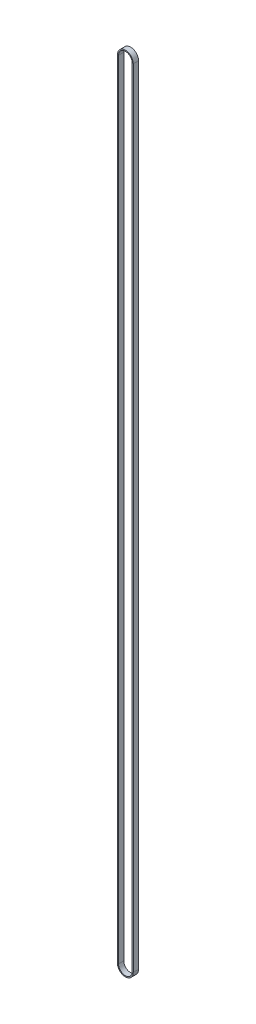
ISO-10303-21;
HEADER;
FILE_DESCRIPTION(('STEP AP214'),'2;1');
FILE_NAME('part.step','',(''),(''),'','','');
FILE_SCHEMA(('AUTOMOTIVE_DESIGN { 1 0 10303 214 1 1 1 1 }'));
ENDSEC;
DATA;
#1=APPLICATION_CONTEXT('core data for automotive mechanical design processes');
#2=APPLICATION_PROTOCOL_DEFINITION('international standard','automotive_design',2000,#1);
#3=PRODUCT_CONTEXT('',#1,'mechanical');
#4=PRODUCT('Part','Part','',(#3));
#5=PRODUCT_RELATED_PRODUCT_CATEGORY('part','',(#4));
#6=PRODUCT_DEFINITION_FORMATION('','',#4);
#7=PRODUCT_DEFINITION_CONTEXT('part definition',#1,'design');
#8=PRODUCT_DEFINITION('design','',#6,#7);
#9=PRODUCT_DEFINITION_SHAPE('','',#8);
#10=(LENGTH_UNIT() NAMED_UNIT(*) SI_UNIT(.MILLI.,.METRE.));
#11=(NAMED_UNIT(*) PLANE_ANGLE_UNIT() SI_UNIT($,.RADIAN.));
#12=(NAMED_UNIT(*) SI_UNIT($,.STERADIAN.) SOLID_ANGLE_UNIT());
#13=UNCERTAINTY_MEASURE_WITH_UNIT(LENGTH_MEASURE(1.E-05),#10,'distance_accuracy_value','');
#14=(GEOMETRIC_REPRESENTATION_CONTEXT(3) GLOBAL_UNCERTAINTY_ASSIGNED_CONTEXT((#13)) GLOBAL_UNIT_ASSIGNED_CONTEXT((#10,
#11,#12)) REPRESENTATION_CONTEXT('',''));
#15=CARTESIAN_POINT('',(0.,0.,0.));
#16=DIRECTION('',(0.,0.,1.));
#17=DIRECTION('',(1.,0.,0.));
#18=AXIS2_PLACEMENT_3D('',#15,#16,#17);
#19=CARTESIAN_POINT('',(0.,753.5,5.));
#20=DIRECTION('',(0.,0.,1.));
#21=DIRECTION('',(1.,0.,0.));
#22=AXIS2_PLACEMENT_3D('',#19,#20,#21);
#23=PLANE('',#22);
#24=CARTESIAN_POINT('',(0.,753.5,5.));
#25=DIRECTION('',(0.,0.,1.));
#26=DIRECTION('',(1.,0.,0.));
#27=AXIS2_PLACEMENT_3D('',#24,#25,#26);
#28=CIRCLE('',#27,7.5);
#29=CARTESIAN_POINT('',(7.5,753.5,5.));
#30=VERTEX_POINT('',#29);
#31=CARTESIAN_POINT('',(-7.5,753.5,5.));
#32=VERTEX_POINT('',#31);
#33=EDGE_CURVE('E136',#30,#32,#28,.T.);
#34=ORIENTED_EDGE('',*,*,#33,.T.);
#35=DIRECTION('',(0.,-1.,0.));
#36=VECTOR('',#35,1.);
#37=CARTESIAN_POINT('',(-7.5,753.5,5.));
#38=LINE('',#37,#36);
#39=CARTESIAN_POINT('',(-7.50000000000009,6.50000000000009,5.));
#40=VERTEX_POINT('',#39);
#41=EDGE_CURVE('E139',#32,#40,#38,.T.);
#42=ORIENTED_EDGE('',*,*,#41,.T.);
#43=CARTESIAN_POINT('',(0.,6.50000000000009,5.));
#44=DIRECTION('',(0.,0.,1.));
#45=DIRECTION('',(-1.,0.,0.));
#46=AXIS2_PLACEMENT_3D('',#43,#44,#45);
#47=CIRCLE('',#46,7.50000000000009);
#48=CARTESIAN_POINT('',(7.50000000000009,6.50000000000006,5.));
#49=VERTEX_POINT('',#48);
#50=EDGE_CURVE('E142',#40,#49,#47,.T.);
#51=ORIENTED_EDGE('',*,*,#50,.T.);
#52=DIRECTION('',(0.,1.,0.));
#53=VECTOR('',#52,1.);
#54=CARTESIAN_POINT('',(7.5,753.5,5.));
#55=LINE('',#54,#53);
#56=EDGE_CURVE('E144',#49,#30,#55,.T.);
#57=ORIENTED_EDGE('',*,*,#56,.T.);
#58=EDGE_LOOP('',(#34,#42,#51,#57));
#59=FACE_BOUND('',#58,.T.);
#60=DIRECTION('',(0.,-1.,0.));
#61=VECTOR('',#60,1.);
#62=CARTESIAN_POINT('',(-6.5,753.5,5.));
#63=LINE('',#62,#61);
#64=CARTESIAN_POINT('',(-6.5,753.5,5.));
#65=VERTEX_POINT('',#64);
#66=CARTESIAN_POINT('',(-6.50000000000009,6.50000000000009,5.));
#67=VERTEX_POINT('',#66);
#68=EDGE_CURVE('E108',#65,#67,#63,.T.);
#69=ORIENTED_EDGE('',*,*,#68,.F.);
#70=CARTESIAN_POINT('',(0.,753.5,5.));
#71=DIRECTION('',(0.,0.,1.));
#72=DIRECTION('',(1.,0.,0.));
#73=AXIS2_PLACEMENT_3D('',#70,#71,#72);
#74=CIRCLE('',#73,6.5);
#75=CARTESIAN_POINT('',(6.5,753.5,5.));
#76=VERTEX_POINT('',#75);
#77=EDGE_CURVE('E100',#76,#65,#74,.T.);
#78=ORIENTED_EDGE('',*,*,#77,.F.);
#79=DIRECTION('',(0.,1.,0.));
#80=VECTOR('',#79,1.);
#81=CARTESIAN_POINT('',(6.5,753.5,5.));
#82=LINE('',#81,#80);
#83=CARTESIAN_POINT('',(6.50000000000009,6.50000000000017,5.));
#84=VERTEX_POINT('',#83);
#85=EDGE_CURVE('E122',#84,#76,#82,.T.);
#86=ORIENTED_EDGE('',*,*,#85,.F.);
#87=CARTESIAN_POINT('',(0.,6.50000000000009,5.));
#88=DIRECTION('',(0.,0.,1.));
#89=DIRECTION('',(-1.,0.,0.));
#90=AXIS2_PLACEMENT_3D('',#87,#88,#89);
#91=CIRCLE('',#90,6.50000000000009);
#92=EDGE_CURVE('E120',#67,#84,#91,.T.);
#93=ORIENTED_EDGE('',*,*,#92,.F.);
#94=EDGE_LOOP('',(#69,#78,#86,#93));
#95=FACE_BOUND('',#94,.T.);
#96=ADVANCED_FACE('F35',(#59,#95),#23,.T.);
#97=CARTESIAN_POINT('',(0.,753.5,0.));
#98=DIRECTION('',(0.,0.,1.));
#99=DIRECTION('',(1.,0.,0.));
#100=AXIS2_PLACEMENT_3D('',#97,#98,#99);
#101=PLANE('',#100);
#102=CARTESIAN_POINT('',(0.,753.5,0.));
#103=DIRECTION('',(0.,0.,1.));
#104=DIRECTION('',(1.,0.,0.));
#105=AXIS2_PLACEMENT_3D('',#102,#103,#104);
#106=CIRCLE('',#105,7.5);
#107=CARTESIAN_POINT('',(7.5,753.5,0.));
#108=VERTEX_POINT('',#107);
#109=CARTESIAN_POINT('',(-7.5,753.5,0.));
#110=VERTEX_POINT('',#109);
#111=EDGE_CURVE('E116',#108,#110,#106,.T.);
#112=ORIENTED_EDGE('',*,*,#111,.F.);
#113=DIRECTION('',(0.,1.,0.));
#114=VECTOR('',#113,1.);
#115=CARTESIAN_POINT('',(7.5,753.5,0.));
#116=LINE('',#115,#114);
#117=CARTESIAN_POINT('',(7.50000000000009,6.50000000000006,0.));
#118=VERTEX_POINT('',#117);
#119=EDGE_CURVE('E140',#118,#108,#116,.T.);
#120=ORIENTED_EDGE('',*,*,#119,.F.);
#121=CARTESIAN_POINT('',(0.,6.50000000000009,0.));
#122=DIRECTION('',(0.,0.,1.));
#123=DIRECTION('',(-1.,0.,0.));
#124=AXIS2_PLACEMENT_3D('',#121,#122,#123);
#125=CIRCLE('',#124,7.50000000000009);
#126=CARTESIAN_POINT('',(-7.50000000000009,6.50000000000009,0.));
#127=VERTEX_POINT('',#126);
#128=EDGE_CURVE('E151',#127,#118,#125,.T.);
#129=ORIENTED_EDGE('',*,*,#128,.F.);
#130=DIRECTION('',(0.,-1.,0.));
#131=VECTOR('',#130,1.);
#132=CARTESIAN_POINT('',(-7.5,753.5,0.));
#133=LINE('',#132,#131);
#134=EDGE_CURVE('E149',#110,#127,#133,.T.);
#135=ORIENTED_EDGE('',*,*,#134,.F.);
#136=EDGE_LOOP('',(#112,#120,#129,#135));
#137=FACE_BOUND('',#136,.T.);
#138=CARTESIAN_POINT('',(0.,753.5,0.));
#139=DIRECTION('',(0.,0.,1.));
#140=DIRECTION('',(1.,0.,0.));
#141=AXIS2_PLACEMENT_3D('',#138,#139,#140);
#142=CIRCLE('',#141,6.5);
#143=CARTESIAN_POINT('',(6.5,753.5,0.));
#144=VERTEX_POINT('',#143);
#145=CARTESIAN_POINT('',(-6.5,753.5,0.));
#146=VERTEX_POINT('',#145);
#147=EDGE_CURVE('E58',#144,#146,#142,.T.);
#148=ORIENTED_EDGE('',*,*,#147,.T.);
#149=DIRECTION('',(0.,-1.,0.));
#150=VECTOR('',#149,1.);
#151=CARTESIAN_POINT('',(-6.5,753.5,0.));
#152=LINE('',#151,#150);
#153=CARTESIAN_POINT('',(-6.50000000000009,6.50000000000009,0.));
#154=VERTEX_POINT('',#153);
#155=EDGE_CURVE('E115',#146,#154,#152,.T.);
#156=ORIENTED_EDGE('',*,*,#155,.T.);
#157=CARTESIAN_POINT('',(0.,6.50000000000009,0.));
#158=DIRECTION('',(0.,0.,1.));
#159=DIRECTION('',(-1.,0.,0.));
#160=AXIS2_PLACEMENT_3D('',#157,#158,#159);
#161=CIRCLE('',#160,6.50000000000009);
#162=CARTESIAN_POINT('',(6.50000000000009,6.50000000000009,0.));
#163=VERTEX_POINT('',#162);
#164=EDGE_CURVE('E128',#154,#163,#161,.T.);
#165=ORIENTED_EDGE('',*,*,#164,.T.);
#166=DIRECTION('',(0.,1.,0.));
#167=VECTOR('',#166,1.);
#168=CARTESIAN_POINT('',(6.5,753.5,0.));
#169=LINE('',#168,#167);
#170=EDGE_CURVE('E109',#163,#144,#169,.T.);
#171=ORIENTED_EDGE('',*,*,#170,.T.);
#172=EDGE_LOOP('',(#148,#156,#165,#171));
#173=FACE_BOUND('',#172,.T.);
#174=ADVANCED_FACE('F169',(#137,#173),#101,.F.);
#175=CARTESIAN_POINT('',(0.,753.5,5.));
#176=DIRECTION('',(0.,0.,-1.));
#177=DIRECTION('',(-1.,0.,0.));
#178=AXIS2_PLACEMENT_3D('',#175,#176,#177);
#179=CYLINDRICAL_SURFACE('',#178,7.5);
#180=ORIENTED_EDGE('',*,*,#111,.T.);
#181=DIRECTION('',(0.,0.,-1.));
#182=VECTOR('',#181,1.);
#183=CARTESIAN_POINT('',(-7.5,753.5,5.));
#184=LINE('',#183,#182);
#185=EDGE_CURVE('E11',#32,#110,#184,.T.);
#186=ORIENTED_EDGE('',*,*,#185,.F.);
#187=ORIENTED_EDGE('',*,*,#33,.F.);
#188=DIRECTION('',(0.,0.,-1.));
#189=VECTOR('',#188,1.);
#190=CARTESIAN_POINT('',(7.5,753.5,5.));
#191=LINE('',#190,#189);
#192=EDGE_CURVE('E146',#30,#108,#191,.T.);
#193=ORIENTED_EDGE('',*,*,#192,.T.);
#194=EDGE_LOOP('',(#180,#186,#187,#193));
#195=FACE_BOUND('',#194,.T.);
#196=ADVANCED_FACE('F37',(#195),#179,.T.);
#197=CARTESIAN_POINT('',(-7.5,753.5,5.));
#198=DIRECTION('',(1.,0.,0.));
#199=DIRECTION('',(0.,1.,0.));
#200=AXIS2_PLACEMENT_3D('',#197,#198,#199);
#201=PLANE('',#200);
#202=ORIENTED_EDGE('',*,*,#134,.T.);
#203=DIRECTION('',(0.,0.,-1.));
#204=VECTOR('',#203,1.);
#205=CARTESIAN_POINT('',(-7.50000000000009,6.50000000000009,5.));
#206=LINE('',#205,#204);
#207=EDGE_CURVE('E43',#40,#127,#206,.T.);
#208=ORIENTED_EDGE('',*,*,#207,.F.);
#209=ORIENTED_EDGE('',*,*,#41,.F.);
#210=ORIENTED_EDGE('',*,*,#185,.T.);
#211=EDGE_LOOP('',(#202,#208,#209,#210));
#212=FACE_BOUND('',#211,.T.);
#213=ADVANCED_FACE('F179',(#212),#201,.F.);
#214=CARTESIAN_POINT('',(0.,6.50000000000009,5.));
#215=DIRECTION('',(0.,0.,-1.));
#216=DIRECTION('',(-1.,0.,0.));
#217=AXIS2_PLACEMENT_3D('',#214,#215,#216);
#218=CYLINDRICAL_SURFACE('',#217,7.50000000000009);
#219=ORIENTED_EDGE('',*,*,#128,.T.);
#220=DIRECTION('',(0.,0.,-1.));
#221=VECTOR('',#220,1.);
#222=CARTESIAN_POINT('',(7.50000000000009,6.50000000000006,5.));
#223=LINE('',#222,#221);
#224=EDGE_CURVE('E156',#49,#118,#223,.T.);
#225=ORIENTED_EDGE('',*,*,#224,.F.);
#226=ORIENTED_EDGE('',*,*,#50,.F.);
#227=ORIENTED_EDGE('',*,*,#207,.T.);
#228=EDGE_LOOP('',(#219,#225,#226,#227));
#229=FACE_BOUND('',#228,.T.);
#230=ADVANCED_FACE('F163',(#229),#218,.T.);
#231=CARTESIAN_POINT('',(7.5,753.5,5.));
#232=DIRECTION('',(-1.,0.,0.));
#233=DIRECTION('',(0.,-1.,0.));
#234=AXIS2_PLACEMENT_3D('',#231,#232,#233);
#235=PLANE('',#234);
#236=ORIENTED_EDGE('',*,*,#119,.T.);
#237=ORIENTED_EDGE('',*,*,#192,.F.);
#238=ORIENTED_EDGE('',*,*,#56,.F.);
#239=ORIENTED_EDGE('',*,*,#224,.T.);
#240=EDGE_LOOP('',(#236,#237,#238,#239));
#241=FACE_BOUND('',#240,.T.);
#242=ADVANCED_FACE('F173',(#241),#235,.F.);
#243=CARTESIAN_POINT('',(0.,753.5,5.));
#244=DIRECTION('',(0.,0.,-1.));
#245=DIRECTION('',(-1.,0.,0.));
#246=AXIS2_PLACEMENT_3D('',#243,#244,#245);
#247=CYLINDRICAL_SURFACE('',#246,6.5);
#248=ORIENTED_EDGE('',*,*,#147,.F.);
#249=DIRECTION('',(0.,0.,-1.));
#250=VECTOR('',#249,1.);
#251=CARTESIAN_POINT('',(6.5,753.5,5.));
#252=LINE('',#251,#250);
#253=EDGE_CURVE('E104',#76,#144,#252,.T.);
#254=ORIENTED_EDGE('',*,*,#253,.F.);
#255=ORIENTED_EDGE('',*,*,#77,.T.);
#256=DIRECTION('',(0.,0.,-1.));
#257=VECTOR('',#256,1.);
#258=CARTESIAN_POINT('',(-6.5,753.5,5.));
#259=LINE('',#258,#257);
#260=EDGE_CURVE('E103',#65,#146,#259,.T.);
#261=ORIENTED_EDGE('',*,*,#260,.T.);
#262=EDGE_LOOP('',(#248,#254,#255,#261));
#263=FACE_BOUND('',#262,.T.);
#264=ADVANCED_FACE('F102',(#263),#247,.F.);
#265=CARTESIAN_POINT('',(-6.5,753.5,5.));
#266=DIRECTION('',(1.,0.,0.));
#267=DIRECTION('',(0.,1.,0.));
#268=AXIS2_PLACEMENT_3D('',#265,#266,#267);
#269=PLANE('',#268);
#270=ORIENTED_EDGE('',*,*,#155,.F.);
#271=ORIENTED_EDGE('',*,*,#260,.F.);
#272=ORIENTED_EDGE('',*,*,#68,.T.);
#273=DIRECTION('',(0.,0.,-1.));
#274=VECTOR('',#273,1.);
#275=CARTESIAN_POINT('',(-6.50000000000009,6.50000000000009,5.));
#276=LINE('',#275,#274);
#277=EDGE_CURVE('E117',#67,#154,#276,.T.);
#278=ORIENTED_EDGE('',*,*,#277,.T.);
#279=EDGE_LOOP('',(#270,#271,#272,#278));
#280=FACE_BOUND('',#279,.T.);
#281=ADVANCED_FACE('F112',(#280),#269,.T.);
#282=CARTESIAN_POINT('',(0.,6.50000000000009,5.));
#283=DIRECTION('',(0.,0.,-1.));
#284=DIRECTION('',(-1.,0.,0.));
#285=AXIS2_PLACEMENT_3D('',#282,#283,#284);
#286=CYLINDRICAL_SURFACE('',#285,6.50000000000009);
#287=ORIENTED_EDGE('',*,*,#164,.F.);
#288=ORIENTED_EDGE('',*,*,#277,.F.);
#289=ORIENTED_EDGE('',*,*,#92,.T.);
#290=DIRECTION('',(0.,0.,-1.));
#291=VECTOR('',#290,1.);
#292=CARTESIAN_POINT('',(6.50000000000009,6.50000000000009,5.));
#293=LINE('',#292,#291);
#294=EDGE_CURVE('E50',#84,#163,#293,.T.);
#295=ORIENTED_EDGE('',*,*,#294,.T.);
#296=EDGE_LOOP('',(#287,#288,#289,#295));
#297=FACE_BOUND('',#296,.T.);
#298=ADVANCED_FACE('F202',(#297),#286,.F.);
#299=CARTESIAN_POINT('',(6.5,753.5,5.));
#300=DIRECTION('',(-1.,0.,0.));
#301=DIRECTION('',(0.,-1.,0.));
#302=AXIS2_PLACEMENT_3D('',#299,#300,#301);
#303=PLANE('',#302);
#304=ORIENTED_EDGE('',*,*,#170,.F.);
#305=ORIENTED_EDGE('',*,*,#294,.F.);
#306=ORIENTED_EDGE('',*,*,#85,.T.);
#307=ORIENTED_EDGE('',*,*,#253,.T.);
#308=EDGE_LOOP('',(#304,#305,#306,#307));
#309=FACE_BOUND('',#308,.T.);
#310=ADVANCED_FACE('F206',(#309),#303,.T.);
#311=CLOSED_SHELL('',(#96,#174,#196,#213,#230,#242,#264,#281,#298,#310));
#312=MANIFOLD_SOLID_BREP('B2',#311);
#313=ADVANCED_BREP_SHAPE_REPRESENTATION('',(#18,#312),#14);
#314=SHAPE_DEFINITION_REPRESENTATION(#9,#313);
ENDSEC;
END-ISO-10303-21;
